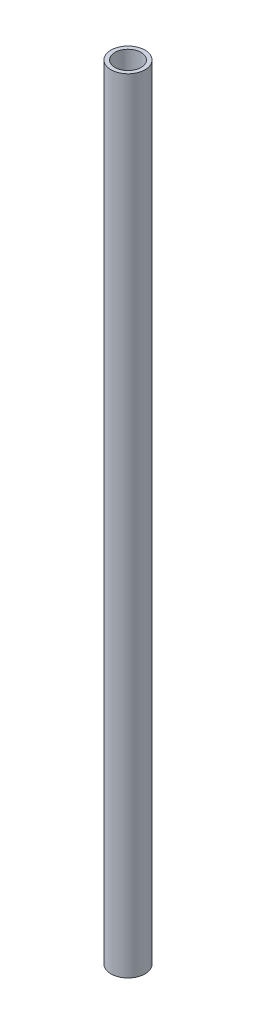
ISO-10303-21;
HEADER;
FILE_DESCRIPTION(('STEP AP214'),'2;1');
FILE_NAME('part.step','',(''),(''),'','','');
FILE_SCHEMA(('AUTOMOTIVE_DESIGN { 1 0 10303 214 1 1 1 1 }'));
ENDSEC;
DATA;
#1=APPLICATION_CONTEXT('core data for automotive mechanical design processes');
#2=APPLICATION_PROTOCOL_DEFINITION('international standard','automotive_design',2000,#1);
#3=PRODUCT_CONTEXT('',#1,'mechanical');
#4=PRODUCT('Part','Part','',(#3));
#5=PRODUCT_RELATED_PRODUCT_CATEGORY('part','',(#4));
#6=PRODUCT_DEFINITION_FORMATION('','',#4);
#7=PRODUCT_DEFINITION_CONTEXT('part definition',#1,'design');
#8=PRODUCT_DEFINITION('design','',#6,#7);
#9=PRODUCT_DEFINITION_SHAPE('','',#8);
#10=(LENGTH_UNIT() NAMED_UNIT(*) SI_UNIT(.MILLI.,.METRE.));
#11=(NAMED_UNIT(*) PLANE_ANGLE_UNIT() SI_UNIT($,.RADIAN.));
#12=(NAMED_UNIT(*) SI_UNIT($,.STERADIAN.) SOLID_ANGLE_UNIT());
#13=UNCERTAINTY_MEASURE_WITH_UNIT(LENGTH_MEASURE(1.E-05),#10,'distance_accuracy_value','');
#14=(GEOMETRIC_REPRESENTATION_CONTEXT(3) GLOBAL_UNCERTAINTY_ASSIGNED_CONTEXT((#13)) GLOBAL_UNIT_ASSIGNED_CONTEXT((#10,
#11,#12)) REPRESENTATION_CONTEXT('',''));
#15=CARTESIAN_POINT('',(0.,0.,0.));
#16=DIRECTION('',(0.,0.,1.));
#17=DIRECTION('',(1.,0.,0.));
#18=AXIS2_PLACEMENT_3D('',#15,#16,#17);
#19=CARTESIAN_POINT('',(0.,146.05,0.));
#20=DIRECTION('',(0.,1.,0.));
#21=DIRECTION('',(0.,0.,1.));
#22=AXIS2_PLACEMENT_3D('',#19,#20,#21);
#23=PLANE('',#22);
#24=CARTESIAN_POINT('',(0.,146.05,0.));
#25=DIRECTION('',(0.,1.,0.));
#26=DIRECTION('',(0.,0.,1.));
#27=AXIS2_PLACEMENT_3D('',#24,#25,#26);
#28=CIRCLE('',#27,6.35);
#29=CARTESIAN_POINT('',(0.,146.05,6.35));
#30=VERTEX_POINT('',#29);
#31=EDGE_CURVE('E10',#30,#30,#28,.T.);
#32=ORIENTED_EDGE('',*,*,#31,.T.);
#33=EDGE_LOOP('',(#32));
#34=FACE_BOUND('',#33,.T.);
#35=CARTESIAN_POINT('',(0.,146.05,0.));
#36=DIRECTION('',(0.,1.,0.));
#37=DIRECTION('',(0.,0.,1.));
#38=AXIS2_PLACEMENT_3D('',#35,#36,#37);
#39=CIRCLE('',#38,4.8768);
#40=CARTESIAN_POINT('',(0.,146.05,4.8768));
#41=VERTEX_POINT('',#40);
#42=EDGE_CURVE('E42',#41,#41,#39,.T.);
#43=ORIENTED_EDGE('',*,*,#42,.F.);
#44=EDGE_LOOP('',(#43));
#45=FACE_BOUND('',#44,.T.);
#46=ADVANCED_FACE('F31',(#34,#45),#23,.T.);
#47=CARTESIAN_POINT('',(0.,-146.05,0.));
#48=DIRECTION('',(0.,1.,0.));
#49=DIRECTION('',(0.,0.,1.));
#50=AXIS2_PLACEMENT_3D('',#47,#48,#49);
#51=PLANE('',#50);
#52=CARTESIAN_POINT('',(0.,-146.05,0.));
#53=DIRECTION('',(0.,1.,0.));
#54=DIRECTION('',(0.,0.,1.));
#55=AXIS2_PLACEMENT_3D('',#52,#53,#54);
#56=CIRCLE('',#55,6.35);
#57=CARTESIAN_POINT('',(0.,-146.05,6.35));
#58=VERTEX_POINT('',#57);
#59=EDGE_CURVE('E35',#58,#58,#56,.T.);
#60=ORIENTED_EDGE('',*,*,#59,.F.);
#61=EDGE_LOOP('',(#60));
#62=FACE_BOUND('',#61,.T.);
#63=CARTESIAN_POINT('',(0.,-146.05,0.));
#64=DIRECTION('',(0.,1.,0.));
#65=DIRECTION('',(0.,0.,1.));
#66=AXIS2_PLACEMENT_3D('',#63,#64,#65);
#67=CIRCLE('',#66,4.8768);
#68=CARTESIAN_POINT('',(0.,-146.05,4.8768));
#69=VERTEX_POINT('',#68);
#70=EDGE_CURVE('E44',#69,#69,#67,.T.);
#71=ORIENTED_EDGE('',*,*,#70,.T.);
#72=EDGE_LOOP('',(#71));
#73=FACE_BOUND('',#72,.T.);
#74=ADVANCED_FACE('F54',(#62,#73),#51,.F.);
#75=CARTESIAN_POINT('',(0.,146.05,0.));
#76=DIRECTION('',(0.,-1.,0.));
#77=DIRECTION('',(0.,0.,-1.));
#78=AXIS2_PLACEMENT_3D('',#75,#76,#77);
#79=CYLINDRICAL_SURFACE('',#78,6.35);
#80=ORIENTED_EDGE('',*,*,#31,.F.);
#81=EDGE_LOOP('',(#80));
#82=FACE_BOUND('',#81,.T.);
#83=ORIENTED_EDGE('',*,*,#59,.T.);
#84=EDGE_LOOP('',(#83));
#85=FACE_BOUND('',#84,.T.);
#86=ADVANCED_FACE('F33',(#82,#85),#79,.T.);
#87=CARTESIAN_POINT('',(0.,146.05,0.));
#88=DIRECTION('',(0.,-1.,0.));
#89=DIRECTION('',(0.,0.,-1.));
#90=AXIS2_PLACEMENT_3D('',#87,#88,#89);
#91=CYLINDRICAL_SURFACE('',#90,4.8768);
#92=ORIENTED_EDGE('',*,*,#42,.T.);
#93=EDGE_LOOP('',(#92));
#94=FACE_BOUND('',#93,.T.);
#95=ORIENTED_EDGE('',*,*,#70,.F.);
#96=EDGE_LOOP('',(#95));
#97=FACE_BOUND('',#96,.T.);
#98=ADVANCED_FACE('F50',(#94,#97),#91,.F.);
#99=CLOSED_SHELL('',(#46,#74,#86,#98));
#100=MANIFOLD_SOLID_BREP('B2',#99);
#101=ADVANCED_BREP_SHAPE_REPRESENTATION('',(#18,#100),#14);
#102=SHAPE_DEFINITION_REPRESENTATION(#9,#101);
ENDSEC;
END-ISO-10303-21;
